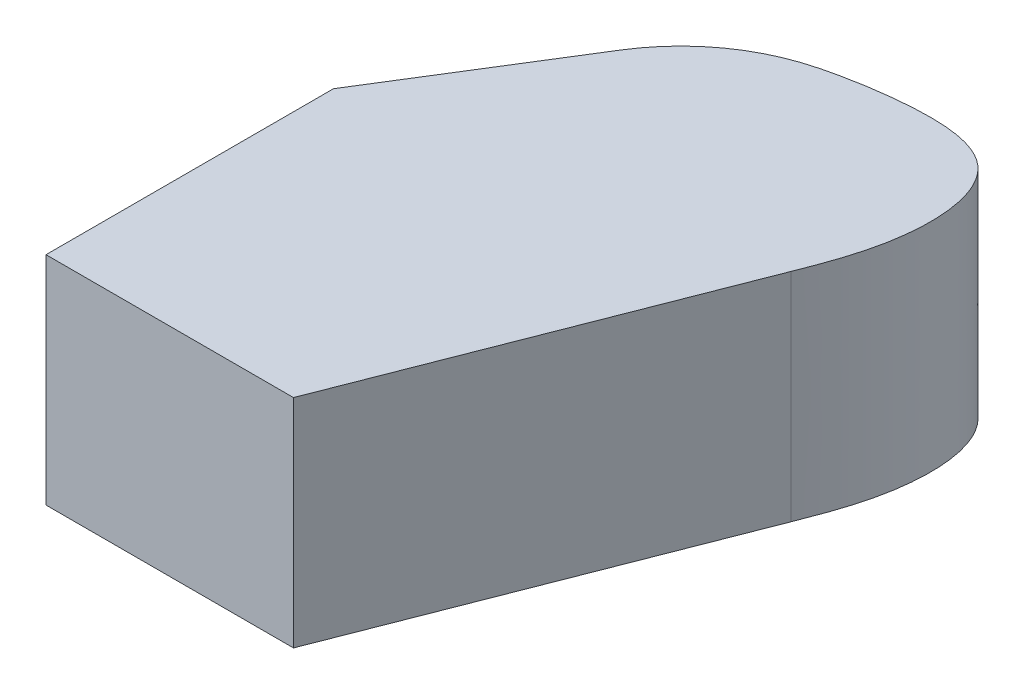
ISO-10303-21;
HEADER;
FILE_DESCRIPTION(('STEP AP214'),'2;1');
FILE_NAME('part.step','',(''),(''),'','','');
FILE_SCHEMA(('AUTOMOTIVE_DESIGN { 1 0 10303 214 1 1 1 1 }'));
ENDSEC;
DATA;
#1=APPLICATION_CONTEXT('core data for automotive mechanical design processes');
#2=APPLICATION_PROTOCOL_DEFINITION('international standard','automotive_design',2000,#1);
#3=PRODUCT_CONTEXT('',#1,'mechanical');
#4=PRODUCT('Part','Part','',(#3));
#5=PRODUCT_RELATED_PRODUCT_CATEGORY('part','',(#4));
#6=PRODUCT_DEFINITION_FORMATION('','',#4);
#7=PRODUCT_DEFINITION_CONTEXT('part definition',#1,'design');
#8=PRODUCT_DEFINITION('design','',#6,#7);
#9=PRODUCT_DEFINITION_SHAPE('','',#8);
#10=(LENGTH_UNIT() NAMED_UNIT(*) SI_UNIT(.MILLI.,.METRE.));
#11=(NAMED_UNIT(*) PLANE_ANGLE_UNIT() SI_UNIT($,.RADIAN.));
#12=(NAMED_UNIT(*) SI_UNIT($,.STERADIAN.) SOLID_ANGLE_UNIT());
#13=UNCERTAINTY_MEASURE_WITH_UNIT(LENGTH_MEASURE(1.E-05),#10,'distance_accuracy_value','');
#14=(GEOMETRIC_REPRESENTATION_CONTEXT(3) GLOBAL_UNCERTAINTY_ASSIGNED_CONTEXT((#13)) GLOBAL_UNIT_ASSIGNED_CONTEXT((#10,
#11,#12)) REPRESENTATION_CONTEXT('',''));
#15=CARTESIAN_POINT('',(0.,0.,0.));
#16=DIRECTION('',(0.,0.,1.));
#17=DIRECTION('',(1.,0.,0.));
#18=AXIS2_PLACEMENT_3D('',#15,#16,#17);
#19=CARTESIAN_POINT('',(-66.6737685117542,58.42,0.));
#20=DIRECTION('',(1.,0.,0.));
#21=DIRECTION('',(0.,0.,-1.));
#22=AXIS2_PLACEMENT_3D('',#19,#20,#21);
#23=PLANE('',#22);
#24=DIRECTION('',(0.,0.,1.));
#25=VECTOR('',#24,1.);
#26=CARTESIAN_POINT('',(-66.6737685117542,0.,0.));
#27=LINE('',#26,#25);
#28=CARTESIAN_POINT('',(-66.6737685117542,0.,0.));
#29=VERTEX_POINT('',#28);
#30=CARTESIAN_POINT('',(-66.6737685117542,0.,77.4518589102709));
#31=VERTEX_POINT('',#30);
#32=EDGE_CURVE('E118',#29,#31,#27,.T.);
#33=ORIENTED_EDGE('',*,*,#32,.T.);
#34=DIRECTION('',(0.,-1.,0.));
#35=VECTOR('',#34,1.);
#36=CARTESIAN_POINT('',(-66.6737685117542,58.42,77.4518589102709));
#37=LINE('',#36,#35);
#38=CARTESIAN_POINT('',(-66.6737685117542,58.42,77.4518589102709));
#39=VERTEX_POINT('',#38);
#40=EDGE_CURVE('E100',#39,#31,#37,.T.);
#41=ORIENTED_EDGE('',*,*,#40,.F.);
#42=DIRECTION('',(0.,0.,1.));
#43=VECTOR('',#42,1.);
#44=CARTESIAN_POINT('',(-66.6737685117542,58.42,0.));
#45=LINE('',#44,#43);
#46=CARTESIAN_POINT('',(-66.6737685117542,58.42,0.));
#47=VERTEX_POINT('',#46);
#48=EDGE_CURVE('E106',#47,#39,#45,.T.);
#49=ORIENTED_EDGE('',*,*,#48,.F.);
#50=DIRECTION('',(0.,-1.,0.));
#51=VECTOR('',#50,1.);
#52=CARTESIAN_POINT('',(-66.6737685117542,58.42,0.));
#53=LINE('',#52,#51);
#54=EDGE_CURVE('E139',#47,#29,#53,.T.);
#55=ORIENTED_EDGE('',*,*,#54,.T.);
#56=EDGE_LOOP('',(#33,#41,#49,#55));
#57=FACE_BOUND('',#56,.T.);
#58=ADVANCED_FACE('F35',(#57),#23,.F.);
#59=CARTESIAN_POINT('',(0.,58.42,77.4518589102709));
#60=DIRECTION('',(0.,0.,-1.));
#61=DIRECTION('',(-1.,0.,0.));
#62=AXIS2_PLACEMENT_3D('',#59,#60,#61);
#63=PLANE('',#62);
#64=DIRECTION('',(1.,0.,0.));
#65=VECTOR('',#64,1.);
#66=CARTESIAN_POINT('',(0.,0.,77.4518589102709));
#67=LINE('',#66,#65);
#68=CARTESIAN_POINT('',(0.,0.,77.4518589102709));
#69=VERTEX_POINT('',#68);
#70=EDGE_CURVE('E148',#31,#69,#67,.T.);
#71=ORIENTED_EDGE('',*,*,#70,.T.);
#72=DIRECTION('',(0.,-1.,0.));
#73=VECTOR('',#72,1.);
#74=CARTESIAN_POINT('',(0.,58.42,77.4518589102709));
#75=LINE('',#74,#73);
#76=CARTESIAN_POINT('',(0.,58.42,77.4518589102709));
#77=VERTEX_POINT('',#76);
#78=EDGE_CURVE('E103',#77,#69,#75,.T.);
#79=ORIENTED_EDGE('',*,*,#78,.F.);
#80=DIRECTION('',(1.,0.,0.));
#81=VECTOR('',#80,1.);
#82=CARTESIAN_POINT('',(0.,58.42,77.4518589102709));
#83=LINE('',#82,#81);
#84=EDGE_CURVE('E96',#39,#77,#83,.T.);
#85=ORIENTED_EDGE('',*,*,#84,.F.);
#86=ORIENTED_EDGE('',*,*,#40,.T.);
#87=EDGE_LOOP('',(#71,#79,#85,#86));
#88=FACE_BOUND('',#87,.T.);
#89=ADVANCED_FACE('F98',(#88),#63,.F.);
#90=CARTESIAN_POINT('',(53.1384921973379,58.42,-58.9035172942189));
#91=DIRECTION('',(-0.93174729177176,0.,-0.363107400469877));
#92=DIRECTION('',(-0.363107400469877,0.,0.93174729177176));
#93=AXIS2_PLACEMENT_3D('',#90,#91,#92);
#94=PLANE('',#93);
#95=DIRECTION('',(0.363107400469877,0.,-0.93174729177176));
#96=VECTOR('',#95,1.);
#97=CARTESIAN_POINT('',(53.1384921973379,0.,-58.9035172942189));
#98=LINE('',#97,#96);
#99=CARTESIAN_POINT('',(37.6056039592773,0.,-19.0455399286293));
#100=VERTEX_POINT('',#99);
#101=EDGE_CURVE('E129',#69,#100,#98,.T.);
#102=ORIENTED_EDGE('',*,*,#101,.T.);
#103=CARTESIAN_POINT('',(37.6056039592773,61.341,-19.0455399286293));
#104=CARTESIAN_POINT('',(37.6056039592773,39.9203333333148,-19.0455399286293));
#105=CARTESIAN_POINT('',(37.6056039592773,18.4996666666666,-19.0455399286293));
#106=CARTESIAN_POINT('',(37.6056039592773,-2.92100000000003,-19.0455399286293));
#107=B_SPLINE_CURVE_WITH_KNOTS('',3,(#103,#104,#105,#106),.UNSPECIFIED.,.F.,.F.,(4,4),
(-0.002921,0.061341),.UNSPECIFIED.);
#108=CARTESIAN_POINT('',(37.6056039592773,58.42,-19.0455399286293));
#109=VERTEX_POINT('',#108);
#110=EDGE_CURVE('E49',#100,#109,#107,.F.);
#111=ORIENTED_EDGE('',*,*,#110,.T.);
#112=DIRECTION('',(0.363107400469877,0.,-0.93174729177176));
#113=VECTOR('',#112,1.);
#114=CARTESIAN_POINT('',(53.1384921973379,58.42,-58.9035172942189));
#115=LINE('',#114,#113);
#116=EDGE_CURVE('E105',#77,#109,#115,.T.);
#117=ORIENTED_EDGE('',*,*,#116,.F.);
#118=ORIENTED_EDGE('',*,*,#78,.T.);
#119=EDGE_LOOP('',(#102,#111,#117,#118));
#120=FACE_BOUND('',#119,.T.);
#121=ADVANCED_FACE('F165',(#120),#94,.F.);
#122=CARTESIAN_POINT('',(6.07748129862949,58.42,-20.8168646313743));
#123=DIRECTION('',(0.,-1.,0.));
#124=DIRECTION('',(0.,0.,-1.));
#125=AXIS2_PLACEMENT_3D('',#122,#123,#124);
#126=CYLINDRICAL_SURFACE('',#125,50.8);
#127=CARTESIAN_POINT('',(6.07748129862949,58.42,-20.8168646313743));
#128=DIRECTION('',(0.,1.,0.));
#129=DIRECTION('',(0.,0.,-1.));
#130=AXIS2_PLACEMENT_3D('',#127,#128,#129);
#131=CIRCLE('',#130,50.8);
#132=CARTESIAN_POINT('',(-9.80831532479552,58.42,-69.0691336520036));
#133=VERTEX_POINT('',#132);
#134=CARTESIAN_POINT('',(-37.0678218733656,58.42,-47.6333299875063));
#135=VERTEX_POINT('',#134);
#136=EDGE_CURVE('E130',#133,#135,#131,.T.);
#137=ORIENTED_EDGE('',*,*,#136,.F.);
#138=CARTESIAN_POINT('',(-9.80831532479552,-2.92100000000001,-69.0691336520036));
#139=CARTESIAN_POINT('',(-9.80831532479552,18.4996666666667,-69.0691336520036));
#140=CARTESIAN_POINT('',(-9.80831532479552,39.9203333333148,-69.0691336520036));
#141=CARTESIAN_POINT('',(-9.80831532479552,61.341,-69.0691336520036));
#142=B_SPLINE_CURVE_WITH_KNOTS('',3,(#138,#139,#140,#141),.UNSPECIFIED.,.F.,.F.,(4,4),
(-0.002921,0.061341),.UNSPECIFIED.);
#143=CARTESIAN_POINT('',(-9.80831532479552,0.,-69.0691336520036));
#144=VERTEX_POINT('',#143);
#145=EDGE_CURVE('E119',#133,#144,#142,.F.);
#146=ORIENTED_EDGE('',*,*,#145,.T.);
#147=CARTESIAN_POINT('',(6.07748129862949,0.,-20.8168646313743));
#148=DIRECTION('',(0.,1.,0.));
#149=DIRECTION('',(0.,0.,-1.));
#150=AXIS2_PLACEMENT_3D('',#147,#148,#149);
#151=CIRCLE('',#150,50.8);
#152=CARTESIAN_POINT('',(-37.0678218733656,0.,-47.6333299875063));
#153=VERTEX_POINT('',#152);
#154=EDGE_CURVE('E126',#144,#153,#151,.T.);
#155=ORIENTED_EDGE('',*,*,#154,.T.);
#156=DIRECTION('',(0.,-1.,0.));
#157=VECTOR('',#156,1.);
#158=CARTESIAN_POINT('',(-37.0678218733656,58.42,-47.6333299875063));
#159=LINE('',#158,#157);
#160=EDGE_CURVE('E122',#135,#153,#159,.T.);
#161=ORIENTED_EDGE('',*,*,#160,.F.);
#162=EDGE_LOOP('',(#137,#146,#155,#161));
#163=FACE_BOUND('',#162,.T.);
#164=ADVANCED_FACE('F175',(#163),#126,.T.);
#165=CARTESIAN_POINT('',(-66.6737685117542,58.42,0.));
#166=DIRECTION('',(0.849316991574704,0.,0.527883176301816));
#167=DIRECTION('',(0.527883176301816,0.,-0.849316991574704));
#168=AXIS2_PLACEMENT_3D('',#165,#166,#167);
#169=PLANE('',#168);
#170=DIRECTION('',(-0.527883176301816,0.,0.849316991574704));
#171=VECTOR('',#170,1.);
#172=CARTESIAN_POINT('',(-66.6737685117542,0.,0.));
#173=LINE('',#172,#171);
#174=EDGE_CURVE('E115',#153,#29,#173,.T.);
#175=ORIENTED_EDGE('',*,*,#174,.T.);
#176=ORIENTED_EDGE('',*,*,#54,.F.);
#177=DIRECTION('',(-0.527883176301816,0.,0.849316991574704));
#178=VECTOR('',#177,1.);
#179=CARTESIAN_POINT('',(-66.6737685117542,58.42,0.));
#180=LINE('',#179,#178);
#181=EDGE_CURVE('E111',#135,#47,#180,.T.);
#182=ORIENTED_EDGE('',*,*,#181,.F.);
#183=ORIENTED_EDGE('',*,*,#160,.T.);
#184=EDGE_LOOP('',(#175,#176,#182,#183));
#185=FACE_BOUND('',#184,.T.);
#186=ADVANCED_FACE('F144',(#185),#169,.F.);
#187=CARTESIAN_POINT('',(6.07748129862949,58.42,-20.8168646313743));
#188=DIRECTION('',(0.,-1.,0.));
#189=DIRECTION('',(0.,0.,-1.));
#190=AXIS2_PLACEMENT_3D('',#187,#188,#189);
#191=PLANE('',#190);
#192=ORIENTED_EDGE('',*,*,#116,.T.);
#193=CARTESIAN_POINT('',(-9.80831532479552,58.4200000000208,-69.0691336520036));
#194=CARTESIAN_POINT('',(-0.482865878773067,58.4200000000208,-72.1392937984251));
#195=CARTESIAN_POINT('',(12.2408667437962,58.4200000000208,-73.8312197331273));
#196=CARTESIAN_POINT('',(37.9571669621601,58.4199999999654,-77.2508196708735));
#197=CARTESIAN_POINT('',(46.7932350546519,58.4199999999654,-65.721320740249));
#198=CARTESIAN_POINT('',(45.9544857703214,58.4200000000208,-40.4690857079123));
#199=CARTESIAN_POINT('',(41.7800448647993,58.4200000000208,-29.7573128182708));
#200=CARTESIAN_POINT('',(37.6056039592773,58.4200000000208,-19.0455399286293));
#201=B_SPLINE_CURVE_WITH_KNOTS('',5,(#193,#194,#195,#196,#197,#198,#199,#200),.UNSPECIFIED.,.F.,
.F.,(6,2,6),(0.,0.5,1.),.UNSPECIFIED.);
#202=EDGE_CURVE('E11',#109,#133,#201,.F.);
#203=ORIENTED_EDGE('',*,*,#202,.T.);
#204=ORIENTED_EDGE('',*,*,#136,.T.);
#205=ORIENTED_EDGE('',*,*,#181,.T.);
#206=ORIENTED_EDGE('',*,*,#48,.T.);
#207=ORIENTED_EDGE('',*,*,#84,.T.);
#208=EDGE_LOOP('',(#192,#203,#204,#205,#206,#207));
#209=FACE_BOUND('',#208,.T.);
#210=ADVANCED_FACE('F109',(#209),#191,.F.);
#211=CARTESIAN_POINT('',(6.07748129862949,0.,-20.8168646313743));
#212=DIRECTION('',(0.,-1.,0.));
#213=DIRECTION('',(0.,0.,-1.));
#214=AXIS2_PLACEMENT_3D('',#211,#212,#213);
#215=PLANE('',#214);
#216=ORIENTED_EDGE('',*,*,#154,.F.);
#217=CARTESIAN_POINT('',(37.6056039592773,9.95297594341693E-13,-19.0455399286293));
#218=CARTESIAN_POINT('',(41.7800448647993,9.87925019568792E-13,-29.7573128182708));
#219=CARTESIAN_POINT('',(45.9544857703214,9.81094545882133E-13,-40.4690857079123));
#220=CARTESIAN_POINT('',(46.7932350546519,-1.66468401563424E-12,-65.721320740249));
#221=CARTESIAN_POINT('',(37.9571669621601,-1.6603472069443E-12,-77.2508196708735));
#222=CARTESIAN_POINT('',(12.2408667437962,1.00136912650761E-12,-73.8312197331273));
#223=CARTESIAN_POINT('',(-0.482865878773067,1.0134037706222E-12,-72.1392937984251));
#224=CARTESIAN_POINT('',(-9.80831532479552,1.02294474974007E-12,-69.0691336520036));
#225=B_SPLINE_CURVE_WITH_KNOTS('',5,(#217,#218,#219,#220,#221,#222,#223,#224),.UNSPECIFIED.,.F.,
.F.,(6,2,6),(0.,0.5,1.),.UNSPECIFIED.);
#226=EDGE_CURVE('E64',#144,#100,#225,.F.);
#227=ORIENTED_EDGE('',*,*,#226,.T.);
#228=ORIENTED_EDGE('',*,*,#101,.F.);
#229=ORIENTED_EDGE('',*,*,#70,.F.);
#230=ORIENTED_EDGE('',*,*,#32,.F.);
#231=ORIENTED_EDGE('',*,*,#174,.F.);
#232=EDGE_LOOP('',(#216,#227,#228,#229,#230,#231));
#233=FACE_BOUND('',#232,.T.);
#234=ADVANCED_FACE('F147',(#233),#215,.T.);
#235=CARTESIAN_POINT('',(-9.80831532479552,61.341,-69.0691336520036));
#236=CARTESIAN_POINT('',(-9.80831532479552,39.9203333333148,-69.0691336520036));
#237=CARTESIAN_POINT('',(-9.80831532479552,18.4996666666667,-69.0691336520036));
#238=CARTESIAN_POINT('',(-9.80831532479552,-2.92100000000001,-69.0691336520036));
#239=CARTESIAN_POINT('',(-0.482865878773067,61.341,-72.1392937984251));
#240=CARTESIAN_POINT('',(-0.482865878773067,39.9203333333148,-72.1392937984251));
#241=CARTESIAN_POINT('',(-0.482865878773067,18.4996666666667,-72.1392937984251));
#242=CARTESIAN_POINT('',(-0.482865878773067,-2.92100000000002,-72.1392937984251));
#243=CARTESIAN_POINT('',(12.2408667437962,61.341,-73.8312197331273));
#244=CARTESIAN_POINT('',(12.2408667437962,39.9203333333148,-73.8312197331273));
#245=CARTESIAN_POINT('',(12.2408667437962,18.4996666666666,-73.8312197331273));
#246=CARTESIAN_POINT('',(12.2408667437962,-2.92100000000003,-73.8312197331273));
#247=CARTESIAN_POINT('',(37.9571669621601,61.341,-77.2508196708735));
#248=CARTESIAN_POINT('',(37.9571669621601,39.9203333328689,-77.2508196708735));
#249=CARTESIAN_POINT('',(37.9571669621601,18.4996666666666,-77.2508196708735));
#250=CARTESIAN_POINT('',(37.9571669621601,-2.92100000000005,-77.2508196708735));
#251=CARTESIAN_POINT('',(46.7932350546519,61.341,-65.721320740249));
#252=CARTESIAN_POINT('',(46.7932350546519,39.9203333328689,-65.721320740249));
#253=CARTESIAN_POINT('',(46.7932350546519,18.4996666666666,-65.721320740249));
#254=CARTESIAN_POINT('',(46.7932350546519,-2.92100000000006,-65.721320740249));
#255=CARTESIAN_POINT('',(45.9544857703214,61.341,-40.4690857079123));
#256=CARTESIAN_POINT('',(45.9544857703214,39.9203333333148,-40.4690857079123));
#257=CARTESIAN_POINT('',(45.9544857703214,18.4996666666666,-40.4690857079123));
#258=CARTESIAN_POINT('',(45.9544857703214,-2.92100000000005,-40.4690857079123));
#259=CARTESIAN_POINT('',(41.7800448647993,61.341,-29.7573128182708));
#260=CARTESIAN_POINT('',(41.7800448647993,39.9203333333148,-29.7573128182708));
#261=CARTESIAN_POINT('',(41.7800448647993,18.4996666666666,-29.7573128182708));
#262=CARTESIAN_POINT('',(41.7800448647993,-2.92100000000004,-29.7573128182708));
#263=CARTESIAN_POINT('',(37.6056039592773,61.341,-19.0455399286293));
#264=CARTESIAN_POINT('',(37.6056039592773,39.9203333333148,-19.0455399286293));
#265=CARTESIAN_POINT('',(37.6056039592773,18.4996666666666,-19.0455399286293));
#266=CARTESIAN_POINT('',(37.6056039592773,-2.92100000000003,-19.0455399286293));
#267=B_SPLINE_SURFACE_WITH_KNOTS('',5,3,((#235,#236,#237,#238),(#239,#240,#241,#242),(#243,#244,
#245,#246),(#247,#248,#249,#250),(#251,#252,#253,#254),(#255,#256,#257,#258),(#259,#260,#261,
#262),(#263,#264,#265,#266)),.UNSPECIFIED.,.F.,.F.,.F.,(6,2,6),(4,4),(0.,0.5,1.),(-0.002921,
0.061341),.UNSPECIFIED.);
#268=ORIENTED_EDGE('',*,*,#202,.F.);
#269=ORIENTED_EDGE('',*,*,#110,.F.);
#270=ORIENTED_EDGE('',*,*,#226,.F.);
#271=ORIENTED_EDGE('',*,*,#145,.F.);
#272=EDGE_LOOP('',(#268,#269,#270,#271));
#273=FACE_BOUND('',#272,.T.);
#274=ADVANCED_FACE('F38',(#273),#267,.T.);
#275=CLOSED_SHELL('',(#58,#89,#121,#164,#186,#210,#234,#274));
#276=MANIFOLD_SOLID_BREP('B2',#275);
#277=ADVANCED_BREP_SHAPE_REPRESENTATION('',(#18,#276),#14);
#278=SHAPE_DEFINITION_REPRESENTATION(#9,#277);
ENDSEC;
END-ISO-10303-21;
